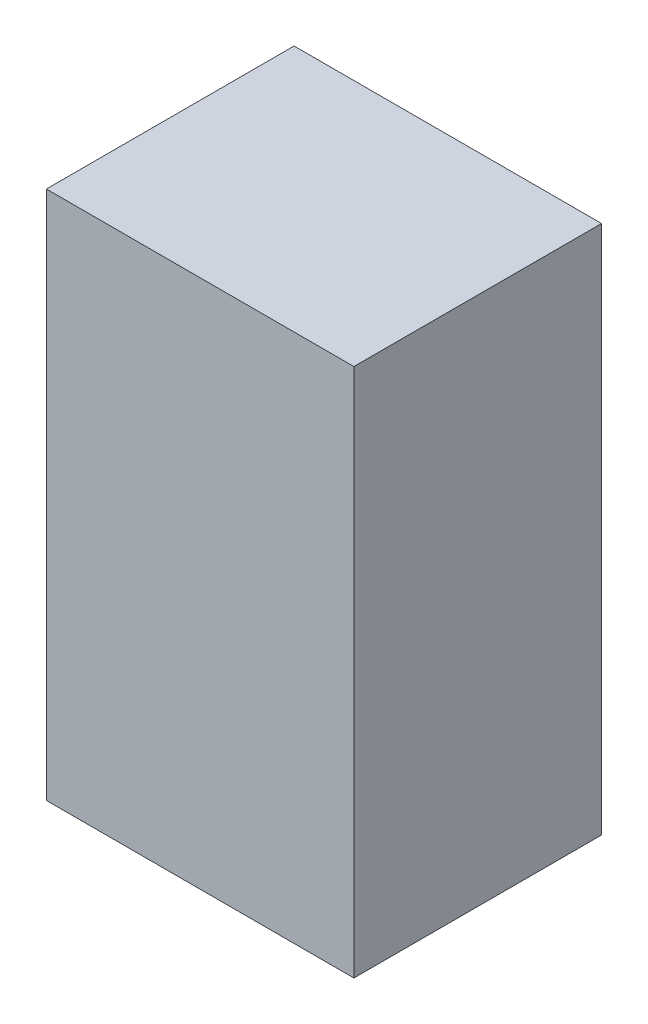
ISO-10303-21;
HEADER;
FILE_DESCRIPTION(('STEP AP214'),'2;1');
FILE_NAME('part.step','',(''),(''),'','','');
FILE_SCHEMA(('AUTOMOTIVE_DESIGN { 1 0 10303 214 1 1 1 1 }'));
ENDSEC;
DATA;
#1=APPLICATION_CONTEXT('core data for automotive mechanical design processes');
#2=APPLICATION_PROTOCOL_DEFINITION('international standard','automotive_design',2000,#1);
#3=PRODUCT_CONTEXT('',#1,'mechanical');
#4=PRODUCT('Part','Part','',(#3));
#5=PRODUCT_RELATED_PRODUCT_CATEGORY('part','',(#4));
#6=PRODUCT_DEFINITION_FORMATION('','',#4);
#7=PRODUCT_DEFINITION_CONTEXT('part definition',#1,'design');
#8=PRODUCT_DEFINITION('design','',#6,#7);
#9=PRODUCT_DEFINITION_SHAPE('','',#8);
#10=(LENGTH_UNIT() NAMED_UNIT(*) SI_UNIT(.MILLI.,.METRE.));
#11=(NAMED_UNIT(*) PLANE_ANGLE_UNIT() SI_UNIT($,.RADIAN.));
#12=(NAMED_UNIT(*) SI_UNIT($,.STERADIAN.) SOLID_ANGLE_UNIT());
#13=UNCERTAINTY_MEASURE_WITH_UNIT(LENGTH_MEASURE(1.E-05),#10,'distance_accuracy_value','');
#14=(GEOMETRIC_REPRESENTATION_CONTEXT(3) GLOBAL_UNCERTAINTY_ASSIGNED_CONTEXT((#13)) GLOBAL_UNIT_ASSIGNED_CONTEXT((#10,
#11,#12)) REPRESENTATION_CONTEXT('',''));
#15=CARTESIAN_POINT('',(0.,0.,0.));
#16=DIRECTION('',(0.,0.,1.));
#17=DIRECTION('',(1.,0.,0.));
#18=AXIS2_PLACEMENT_3D('',#15,#16,#17);
#19=CARTESIAN_POINT('',(-0.90000074,1.54999944,1.45));
#20=DIRECTION('',(0.,0.,1.));
#21=DIRECTION('',(1.,0.,0.));
#22=AXIS2_PLACEMENT_3D('',#19,#20,#21);
#23=PLANE('',#22);
#24=DIRECTION('',(1.,0.,0.));
#25=VECTOR('',#24,1.);
#26=CARTESIAN_POINT('',(0.90000074,-1.54999944,1.45));
#27=LINE('',#26,#25);
#28=CARTESIAN_POINT('',(0.90000074,-1.54999944,1.45));
#29=VERTEX_POINT('',#28);
#30=CARTESIAN_POINT('',(-0.90000074,-1.54999944,1.45));
#31=VERTEX_POINT('',#30);
#32=EDGE_CURVE('E58',#29,#31,#27,.F.);
#33=ORIENTED_EDGE('',*,*,#32,.F.);
#34=DIRECTION('',(0.,1.,0.));
#35=VECTOR('',#34,1.);
#36=CARTESIAN_POINT('',(0.90000074,1.54999944,1.45));
#37=LINE('',#36,#35);
#38=CARTESIAN_POINT('',(0.90000074,1.54999944,1.45));
#39=VERTEX_POINT('',#38);
#40=EDGE_CURVE('E53',#39,#29,#37,.F.);
#41=ORIENTED_EDGE('',*,*,#40,.F.);
#42=DIRECTION('',(1.,0.,0.));
#43=VECTOR('',#42,1.);
#44=CARTESIAN_POINT('',(-0.90000074,1.54999944,1.45));
#45=LINE('',#44,#43);
#46=CARTESIAN_POINT('',(-0.90000074,1.54999944,1.45));
#47=VERTEX_POINT('',#46);
#48=EDGE_CURVE('E68',#47,#39,#45,.T.);
#49=ORIENTED_EDGE('',*,*,#48,.F.);
#50=DIRECTION('',(0.,1.,0.));
#51=VECTOR('',#50,1.);
#52=CARTESIAN_POINT('',(-0.90000074,-1.54999944,1.45));
#53=LINE('',#52,#51);
#54=EDGE_CURVE('E20',#31,#47,#53,.T.);
#55=ORIENTED_EDGE('',*,*,#54,.F.);
#56=EDGE_LOOP('',(#33,#41,#49,#55));
#57=FACE_BOUND('',#56,.T.);
#58=ADVANCED_FACE('F17',(#57),#23,.T.);
#59=CARTESIAN_POINT('',(-0.90000074,-1.54999944,0.));
#60=DIRECTION('',(-1.,0.,0.));
#61=DIRECTION('',(0.,0.,1.));
#62=AXIS2_PLACEMENT_3D('',#59,#60,#61);
#63=PLANE('',#62);
#64=DIRECTION('',(0.,0.,1.));
#65=VECTOR('',#64,1.);
#66=CARTESIAN_POINT('',(-0.90000074,1.54999944,0.));
#67=LINE('',#66,#65);
#68=CARTESIAN_POINT('',(-0.90000074,1.54999944,0.));
#69=VERTEX_POINT('',#68);
#70=EDGE_CURVE('E79',#69,#47,#67,.T.);
#71=ORIENTED_EDGE('',*,*,#70,.F.);
#72=DIRECTION('',(0.,1.,0.));
#73=VECTOR('',#72,1.);
#74=CARTESIAN_POINT('',(-0.90000074,1.54999944,0.));
#75=LINE('',#74,#73);
#76=CARTESIAN_POINT('',(-0.90000074,-1.54999944,0.));
#77=VERTEX_POINT('',#76);
#78=EDGE_CURVE('E74',#69,#77,#75,.F.);
#79=ORIENTED_EDGE('',*,*,#78,.T.);
#80=DIRECTION('',(0.,0.,-1.));
#81=VECTOR('',#80,1.);
#82=CARTESIAN_POINT('',(-0.90000074,-1.54999944,0.));
#83=LINE('',#82,#81);
#84=EDGE_CURVE('E63',#31,#77,#83,.T.);
#85=ORIENTED_EDGE('',*,*,#84,.F.);
#86=ORIENTED_EDGE('',*,*,#54,.T.);
#87=EDGE_LOOP('',(#71,#79,#85,#86));
#88=FACE_BOUND('',#87,.T.);
#89=ADVANCED_FACE('F73',(#88),#63,.T.);
#90=CARTESIAN_POINT('',(0.90000074,-1.54999944,0.));
#91=DIRECTION('',(0.,-1.,0.));
#92=DIRECTION('',(0.,0.,-1.));
#93=AXIS2_PLACEMENT_3D('',#90,#91,#92);
#94=PLANE('',#93);
#95=ORIENTED_EDGE('',*,*,#84,.T.);
#96=DIRECTION('',(1.,0.,0.));
#97=VECTOR('',#96,1.);
#98=CARTESIAN_POINT('',(-0.90000074,-1.54999944,0.));
#99=LINE('',#98,#97);
#100=CARTESIAN_POINT('',(0.90000074,-1.54999944,0.));
#101=VERTEX_POINT('',#100);
#102=EDGE_CURVE('E84',#77,#101,#99,.T.);
#103=ORIENTED_EDGE('',*,*,#102,.T.);
#104=DIRECTION('',(0.,0.,-1.));
#105=VECTOR('',#104,1.);
#106=CARTESIAN_POINT('',(0.90000074,-1.54999944,0.));
#107=LINE('',#106,#105);
#108=EDGE_CURVE('E65',#29,#101,#107,.T.);
#109=ORIENTED_EDGE('',*,*,#108,.F.);
#110=ORIENTED_EDGE('',*,*,#32,.T.);
#111=EDGE_LOOP('',(#95,#103,#109,#110));
#112=FACE_BOUND('',#111,.T.);
#113=ADVANCED_FACE('F60',(#112),#94,.T.);
#114=CARTESIAN_POINT('',(0.90000074,1.54999944,0.));
#115=DIRECTION('',(1.,0.,0.));
#116=DIRECTION('',(0.,0.,-1.));
#117=AXIS2_PLACEMENT_3D('',#114,#115,#116);
#118=PLANE('',#117);
#119=ORIENTED_EDGE('',*,*,#108,.T.);
#120=DIRECTION('',(0.,1.,0.));
#121=VECTOR('',#120,1.);
#122=CARTESIAN_POINT('',(0.90000074,1.54999944,0.));
#123=LINE('',#122,#121);
#124=CARTESIAN_POINT('',(0.90000074,1.54999944,0.));
#125=VERTEX_POINT('',#124);
#126=EDGE_CURVE('E26',#101,#125,#123,.T.);
#127=ORIENTED_EDGE('',*,*,#126,.T.);
#128=DIRECTION('',(0.,0.,1.));
#129=VECTOR('',#128,1.);
#130=CARTESIAN_POINT('',(0.90000074,1.54999944,0.));
#131=LINE('',#130,#129);
#132=EDGE_CURVE('E34',#39,#125,#131,.F.);
#133=ORIENTED_EDGE('',*,*,#132,.F.);
#134=ORIENTED_EDGE('',*,*,#40,.T.);
#135=EDGE_LOOP('',(#119,#127,#133,#134));
#136=FACE_BOUND('',#135,.T.);
#137=ADVANCED_FACE('F88',(#136),#118,.T.);
#138=CARTESIAN_POINT('',(-0.90000074,1.54999944,0.));
#139=DIRECTION('',(0.,1.,0.));
#140=DIRECTION('',(0.,0.,1.));
#141=AXIS2_PLACEMENT_3D('',#138,#139,#140);
#142=PLANE('',#141);
#143=ORIENTED_EDGE('',*,*,#132,.T.);
#144=DIRECTION('',(1.,0.,0.));
#145=VECTOR('',#144,1.);
#146=CARTESIAN_POINT('',(-0.90000074,1.54999944,0.));
#147=LINE('',#146,#145);
#148=EDGE_CURVE('E11',#125,#69,#147,.F.);
#149=ORIENTED_EDGE('',*,*,#148,.T.);
#150=ORIENTED_EDGE('',*,*,#70,.T.);
#151=ORIENTED_EDGE('',*,*,#48,.T.);
#152=EDGE_LOOP('',(#143,#149,#150,#151));
#153=FACE_BOUND('',#152,.T.);
#154=ADVANCED_FACE('F91',(#153),#142,.T.);
#155=CARTESIAN_POINT('',(-0.90000074,1.54999944,0.));
#156=DIRECTION('',(0.,0.,1.));
#157=DIRECTION('',(1.,0.,0.));
#158=AXIS2_PLACEMENT_3D('',#155,#156,#157);
#159=PLANE('',#158);
#160=ORIENTED_EDGE('',*,*,#126,.F.);
#161=ORIENTED_EDGE('',*,*,#102,.F.);
#162=ORIENTED_EDGE('',*,*,#78,.F.);
#163=ORIENTED_EDGE('',*,*,#148,.F.);
#164=EDGE_LOOP('',(#160,#161,#162,#163));
#165=FACE_BOUND('',#164,.T.);
#166=ADVANCED_FACE('F90',(#165),#159,.F.);
#167=CLOSED_SHELL('',(#58,#89,#113,#137,#154,#166));
#168=MANIFOLD_SOLID_BREP('B1',#167);
#169=ADVANCED_BREP_SHAPE_REPRESENTATION('',(#18,#168),#14);
#170=SHAPE_DEFINITION_REPRESENTATION(#9,#169);
ENDSEC;
END-ISO-10303-21;
